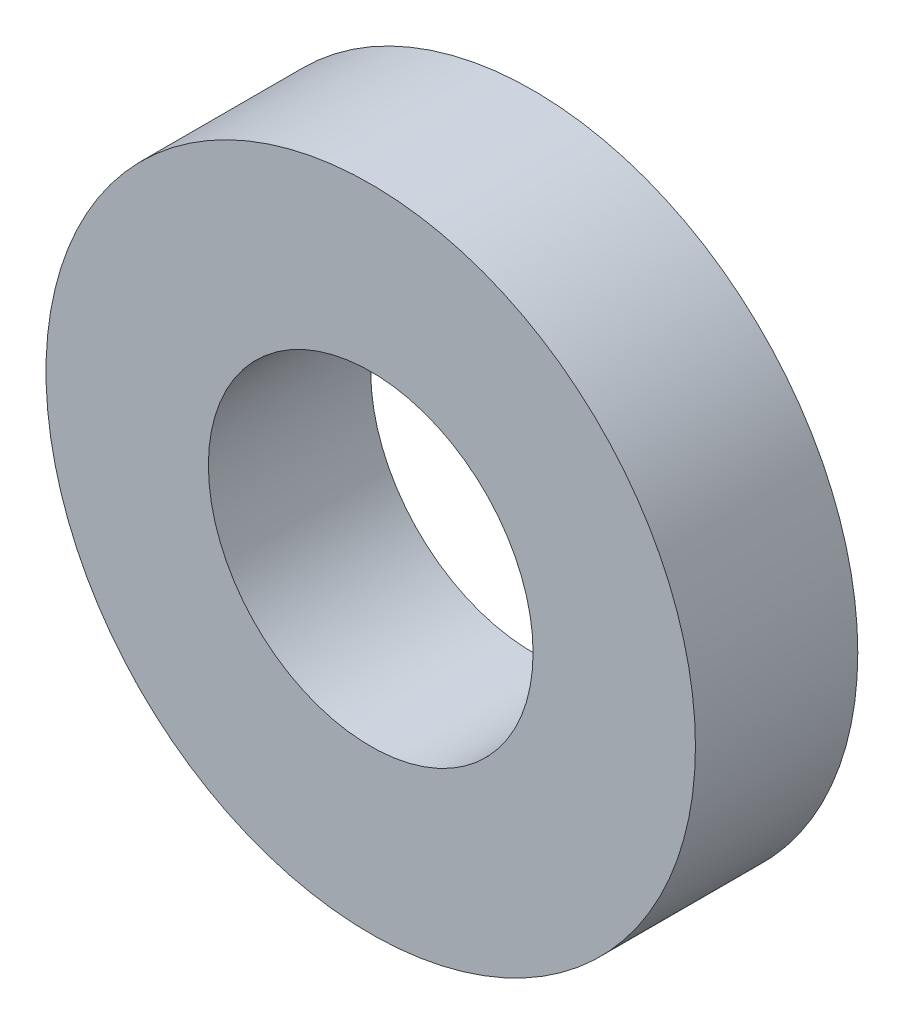
ISO-10303-21;
HEADER;
FILE_DESCRIPTION(('STEP AP214'),'2;1');
FILE_NAME('part.step','',(''),(''),'','','');
FILE_SCHEMA(('AUTOMOTIVE_DESIGN { 1 0 10303 214 1 1 1 1 }'));
ENDSEC;
DATA;
#1=APPLICATION_CONTEXT('core data for automotive mechanical design processes');
#2=APPLICATION_PROTOCOL_DEFINITION('international standard','automotive_design',2000,#1);
#3=PRODUCT_CONTEXT('',#1,'mechanical');
#4=PRODUCT('Part','Part','',(#3));
#5=PRODUCT_RELATED_PRODUCT_CATEGORY('part','',(#4));
#6=PRODUCT_DEFINITION_FORMATION('','',#4);
#7=PRODUCT_DEFINITION_CONTEXT('part definition',#1,'design');
#8=PRODUCT_DEFINITION('design','',#6,#7);
#9=PRODUCT_DEFINITION_SHAPE('','',#8);
#10=(LENGTH_UNIT() NAMED_UNIT(*) SI_UNIT(.MILLI.,.METRE.));
#11=(NAMED_UNIT(*) PLANE_ANGLE_UNIT() SI_UNIT($,.RADIAN.));
#12=(NAMED_UNIT(*) SI_UNIT($,.STERADIAN.) SOLID_ANGLE_UNIT());
#13=UNCERTAINTY_MEASURE_WITH_UNIT(LENGTH_MEASURE(1.E-05),#10,'distance_accuracy_value','');
#14=(GEOMETRIC_REPRESENTATION_CONTEXT(3) GLOBAL_UNCERTAINTY_ASSIGNED_CONTEXT((#13)) GLOBAL_UNIT_ASSIGNED_CONTEXT((#10,
#11,#12)) REPRESENTATION_CONTEXT('',''));
#15=CARTESIAN_POINT('',(0.,0.,0.));
#16=DIRECTION('',(0.,0.,1.));
#17=DIRECTION('',(1.,0.,0.));
#18=AXIS2_PLACEMENT_3D('',#15,#16,#17);
#19=CARTESIAN_POINT('',(0.,0.,1.5));
#20=DIRECTION('',(0.,0.,1.));
#21=DIRECTION('',(1.,0.,0.));
#22=AXIS2_PLACEMENT_3D('',#19,#20,#21);
#23=PLANE('',#22);
#24=CARTESIAN_POINT('',(0.,0.,1.5));
#25=DIRECTION('',(0.,0.,1.));
#26=DIRECTION('',(1.,0.,0.));
#27=AXIS2_PLACEMENT_3D('',#24,#25,#26);
#28=CIRCLE('',#27,3.);
#29=CARTESIAN_POINT('',(3.,0.,1.5));
#30=VERTEX_POINT('',#29);
#31=EDGE_CURVE('E10',#30,#30,#28,.T.);
#32=ORIENTED_EDGE('',*,*,#31,.T.);
#33=EDGE_LOOP('',(#32));
#34=FACE_BOUND('',#33,.T.);
#35=CARTESIAN_POINT('',(0.,0.,1.5));
#36=DIRECTION('',(0.,0.,1.));
#37=DIRECTION('',(1.,0.,0.));
#38=AXIS2_PLACEMENT_3D('',#35,#36,#37);
#39=CIRCLE('',#38,1.5);
#40=CARTESIAN_POINT('',(1.5,0.,1.5));
#41=VERTEX_POINT('',#40);
#42=EDGE_CURVE('E54',#41,#41,#39,.T.);
#43=ORIENTED_EDGE('',*,*,#42,.F.);
#44=EDGE_LOOP('',(#43));
#45=FACE_BOUND('',#44,.T.);
#46=ADVANCED_FACE('F41',(#34,#45),#23,.T.);
#47=CARTESIAN_POINT('',(0.,0.,0.));
#48=DIRECTION('',(0.,0.,1.));
#49=DIRECTION('',(1.,0.,0.));
#50=AXIS2_PLACEMENT_3D('',#47,#48,#49);
#51=PLANE('',#50);
#52=CARTESIAN_POINT('',(0.,0.,0.));
#53=DIRECTION('',(0.,0.,1.));
#54=DIRECTION('',(1.,0.,0.));
#55=AXIS2_PLACEMENT_3D('',#52,#53,#54);
#56=CIRCLE('',#55,3.);
#57=CARTESIAN_POINT('',(3.,0.,0.));
#58=VERTEX_POINT('',#57);
#59=EDGE_CURVE('E45',#58,#58,#56,.T.);
#60=ORIENTED_EDGE('',*,*,#59,.F.);
#61=EDGE_LOOP('',(#60));
#62=FACE_BOUND('',#61,.T.);
#63=CARTESIAN_POINT('',(0.,0.,0.));
#64=DIRECTION('',(0.,0.,1.));
#65=DIRECTION('',(1.,0.,0.));
#66=AXIS2_PLACEMENT_3D('',#63,#64,#65);
#67=CIRCLE('',#66,1.5);
#68=CARTESIAN_POINT('',(1.5,0.,0.));
#69=VERTEX_POINT('',#68);
#70=EDGE_CURVE('E56',#69,#69,#67,.T.);
#71=ORIENTED_EDGE('',*,*,#70,.T.);
#72=EDGE_LOOP('',(#71));
#73=FACE_BOUND('',#72,.T.);
#74=ADVANCED_FACE('F68',(#62,#73),#51,.F.);
#75=CARTESIAN_POINT('',(0.,0.,1.5));
#76=DIRECTION('',(0.,0.,-1.));
#77=DIRECTION('',(-1.,0.,0.));
#78=AXIS2_PLACEMENT_3D('',#75,#76,#77);
#79=CYLINDRICAL_SURFACE('',#78,3.);
#80=ORIENTED_EDGE('',*,*,#31,.F.);
#81=EDGE_LOOP('',(#80));
#82=FACE_BOUND('',#81,.T.);
#83=ORIENTED_EDGE('',*,*,#59,.T.);
#84=EDGE_LOOP('',(#83));
#85=FACE_BOUND('',#84,.T.);
#86=ADVANCED_FACE('F43',(#82,#85),#79,.T.);
#87=CARTESIAN_POINT('',(0.,0.,1.5));
#88=DIRECTION('',(0.,0.,-1.));
#89=DIRECTION('',(-1.,0.,0.));
#90=AXIS2_PLACEMENT_3D('',#87,#88,#89);
#91=CYLINDRICAL_SURFACE('',#90,1.5);
#92=ORIENTED_EDGE('',*,*,#42,.T.);
#93=EDGE_LOOP('',(#92));
#94=FACE_BOUND('',#93,.T.);
#95=ORIENTED_EDGE('',*,*,#70,.F.);
#96=EDGE_LOOP('',(#95));
#97=FACE_BOUND('',#96,.T.);
#98=ADVANCED_FACE('F64',(#94,#97),#91,.F.);
#99=CLOSED_SHELL('',(#46,#74,#86,#98));
#100=MANIFOLD_SOLID_BREP('B2',#99);
#101=ADVANCED_BREP_SHAPE_REPRESENTATION('',(#18,#100),#14);
#102=SHAPE_DEFINITION_REPRESENTATION(#9,#101);
ENDSEC;
END-ISO-10303-21;
